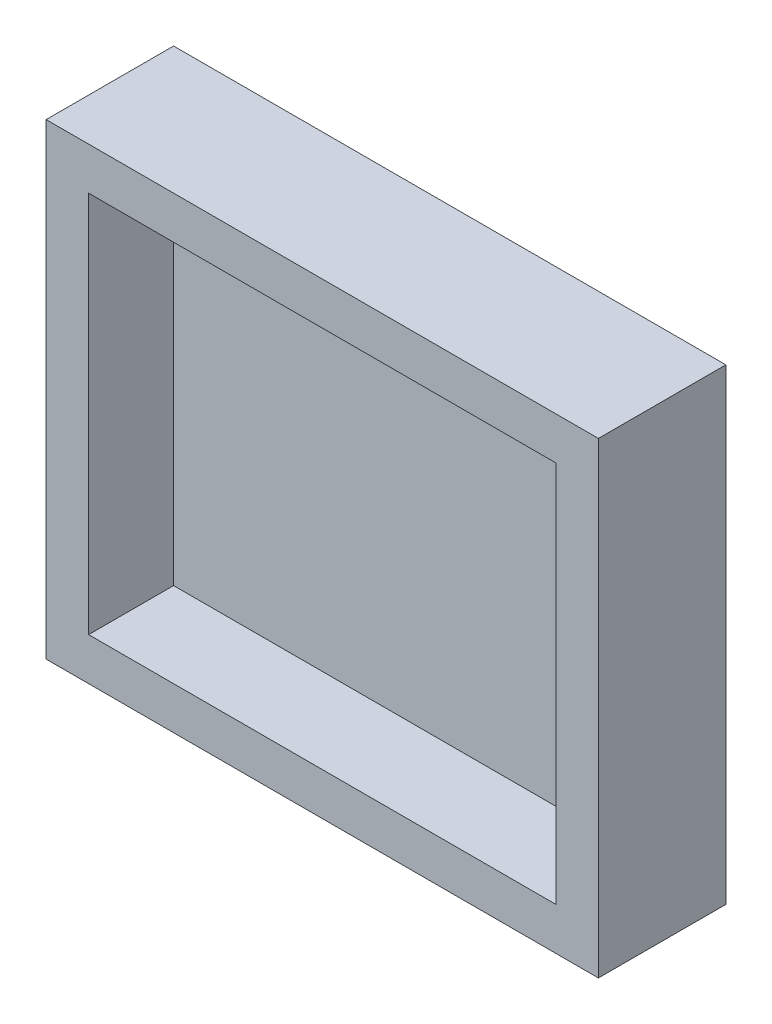
ISO-10303-21;
HEADER;
FILE_DESCRIPTION(('STEP AP214'),'2;1');
FILE_NAME('part.step','',(''),(''),'','','');
FILE_SCHEMA(('AUTOMOTIVE_DESIGN { 1 0 10303 214 1 1 1 1 }'));
ENDSEC;
DATA;
#1=APPLICATION_CONTEXT('core data for automotive mechanical design processes');
#2=APPLICATION_PROTOCOL_DEFINITION('international standard','automotive_design',2000,#1);
#3=PRODUCT_CONTEXT('',#1,'mechanical');
#4=PRODUCT('Part','Part','',(#3));
#5=PRODUCT_RELATED_PRODUCT_CATEGORY('part','',(#4));
#6=PRODUCT_DEFINITION_FORMATION('','',#4);
#7=PRODUCT_DEFINITION_CONTEXT('part definition',#1,'design');
#8=PRODUCT_DEFINITION('design','',#6,#7);
#9=PRODUCT_DEFINITION_SHAPE('','',#8);
#10=(LENGTH_UNIT() NAMED_UNIT(*) SI_UNIT(.MILLI.,.METRE.));
#11=(NAMED_UNIT(*) PLANE_ANGLE_UNIT() SI_UNIT($,.RADIAN.));
#12=(NAMED_UNIT(*) SI_UNIT($,.STERADIAN.) SOLID_ANGLE_UNIT());
#13=UNCERTAINTY_MEASURE_WITH_UNIT(LENGTH_MEASURE(1.E-05),#10,'distance_accuracy_value','');
#14=(GEOMETRIC_REPRESENTATION_CONTEXT(3) GLOBAL_UNCERTAINTY_ASSIGNED_CONTEXT((#13)) GLOBAL_UNIT_ASSIGNED_CONTEXT((#10,
#11,#12)) REPRESENTATION_CONTEXT('',''));
#15=CARTESIAN_POINT('',(0.,0.,0.));
#16=DIRECTION('',(0.,0.,1.));
#17=DIRECTION('',(1.,0.,0.));
#18=AXIS2_PLACEMENT_3D('',#15,#16,#17);
#19=CARTESIAN_POINT('',(-32.5,-27.5,15.));
#20=DIRECTION('',(0.,1.,0.));
#21=DIRECTION('',(0.,0.,1.));
#22=AXIS2_PLACEMENT_3D('',#19,#20,#21);
#23=PLANE('',#22);
#24=DIRECTION('',(1.,0.,0.));
#25=VECTOR('',#24,1.);
#26=CARTESIAN_POINT('',(-32.5,-27.5,0.));
#27=LINE('',#26,#25);
#28=CARTESIAN_POINT('',(-32.5,-27.5,0.));
#29=VERTEX_POINT('',#28);
#30=CARTESIAN_POINT('',(32.5,-27.5,0.));
#31=VERTEX_POINT('',#30);
#32=EDGE_CURVE('E140',#29,#31,#27,.T.);
#33=ORIENTED_EDGE('',*,*,#32,.T.);
#34=DIRECTION('',(0.,0.,-1.));
#35=VECTOR('',#34,1.);
#36=CARTESIAN_POINT('',(32.5,-27.5,15.));
#37=LINE('',#36,#35);
#38=CARTESIAN_POINT('',(32.5,-27.5,15.));
#39=VERTEX_POINT('',#38);
#40=EDGE_CURVE('E11',#39,#31,#37,.T.);
#41=ORIENTED_EDGE('',*,*,#40,.F.);
#42=DIRECTION('',(1.,0.,0.));
#43=VECTOR('',#42,1.);
#44=CARTESIAN_POINT('',(-32.5,-27.5,15.));
#45=LINE('',#44,#43);
#46=CARTESIAN_POINT('',(-32.5,-27.5,15.));
#47=VERTEX_POINT('',#46);
#48=EDGE_CURVE('E144',#47,#39,#45,.T.);
#49=ORIENTED_EDGE('',*,*,#48,.F.);
#50=DIRECTION('',(0.,0.,-1.));
#51=VECTOR('',#50,1.);
#52=CARTESIAN_POINT('',(-32.5,-27.5,15.));
#53=LINE('',#52,#51);
#54=EDGE_CURVE('E56',#47,#29,#53,.T.);
#55=ORIENTED_EDGE('',*,*,#54,.T.);
#56=EDGE_LOOP('',(#33,#41,#49,#55));
#57=FACE_BOUND('',#56,.T.);
#58=ADVANCED_FACE('F33',(#57),#23,.F.);
#59=CARTESIAN_POINT('',(32.5,-27.5,15.));
#60=DIRECTION('',(-1.,0.,0.));
#61=DIRECTION('',(0.,0.,1.));
#62=AXIS2_PLACEMENT_3D('',#59,#60,#61);
#63=PLANE('',#62);
#64=DIRECTION('',(0.,1.,0.));
#65=VECTOR('',#64,1.);
#66=CARTESIAN_POINT('',(32.5,-27.5,0.));
#67=LINE('',#66,#65);
#68=CARTESIAN_POINT('',(32.5,27.5,0.));
#69=VERTEX_POINT('',#68);
#70=EDGE_CURVE('E154',#31,#69,#67,.T.);
#71=ORIENTED_EDGE('',*,*,#70,.T.);
#72=DIRECTION('',(0.,0.,-1.));
#73=VECTOR('',#72,1.);
#74=CARTESIAN_POINT('',(32.5,27.5,15.));
#75=LINE('',#74,#73);
#76=CARTESIAN_POINT('',(32.5,27.5,15.));
#77=VERTEX_POINT('',#76);
#78=EDGE_CURVE('E40',#77,#69,#75,.T.);
#79=ORIENTED_EDGE('',*,*,#78,.F.);
#80=DIRECTION('',(0.,1.,0.));
#81=VECTOR('',#80,1.);
#82=CARTESIAN_POINT('',(32.5,-27.5,15.));
#83=LINE('',#82,#81);
#84=EDGE_CURVE('E82',#39,#77,#83,.T.);
#85=ORIENTED_EDGE('',*,*,#84,.F.);
#86=ORIENTED_EDGE('',*,*,#40,.T.);
#87=EDGE_LOOP('',(#71,#79,#85,#86));
#88=FACE_BOUND('',#87,.T.);
#89=ADVANCED_FACE('F168',(#88),#63,.F.);
#90=CARTESIAN_POINT('',(-32.5,27.5,15.));
#91=DIRECTION('',(0.,1.,0.));
#92=DIRECTION('',(0.,0.,1.));
#93=AXIS2_PLACEMENT_3D('',#90,#91,#92);
#94=PLANE('',#93);
#95=DIRECTION('',(1.,0.,0.));
#96=VECTOR('',#95,1.);
#97=CARTESIAN_POINT('',(-32.5,27.5,0.));
#98=LINE('',#97,#96);
#99=CARTESIAN_POINT('',(-32.5,27.5,0.));
#100=VERTEX_POINT('',#99);
#101=EDGE_CURVE('E157',#100,#69,#98,.T.);
#102=ORIENTED_EDGE('',*,*,#101,.F.);
#103=DIRECTION('',(0.,0.,-1.));
#104=VECTOR('',#103,1.);
#105=CARTESIAN_POINT('',(-32.5,27.5,15.));
#106=LINE('',#105,#104);
#107=CARTESIAN_POINT('',(-32.5,27.5,15.));
#108=VERTEX_POINT('',#107);
#109=EDGE_CURVE('E163',#108,#100,#106,.T.);
#110=ORIENTED_EDGE('',*,*,#109,.F.);
#111=DIRECTION('',(1.,0.,0.));
#112=VECTOR('',#111,1.);
#113=CARTESIAN_POINT('',(-32.5,27.5,15.));
#114=LINE('',#113,#112);
#115=EDGE_CURVE('E148',#108,#77,#114,.T.);
#116=ORIENTED_EDGE('',*,*,#115,.T.);
#117=ORIENTED_EDGE('',*,*,#78,.T.);
#118=EDGE_LOOP('',(#102,#110,#116,#117));
#119=FACE_BOUND('',#118,.T.);
#120=ADVANCED_FACE('F166',(#119),#94,.T.);
#121=CARTESIAN_POINT('',(-32.5,-27.5,15.));
#122=DIRECTION('',(-1.,0.,0.));
#123=DIRECTION('',(0.,0.,1.));
#124=AXIS2_PLACEMENT_3D('',#121,#122,#123);
#125=PLANE('',#124);
#126=DIRECTION('',(0.,1.,0.));
#127=VECTOR('',#126,1.);
#128=CARTESIAN_POINT('',(-32.5,-27.5,0.));
#129=LINE('',#128,#127);
#130=EDGE_CURVE('E146',#29,#100,#129,.T.);
#131=ORIENTED_EDGE('',*,*,#130,.F.);
#132=ORIENTED_EDGE('',*,*,#54,.F.);
#133=DIRECTION('',(0.,1.,0.));
#134=VECTOR('',#133,1.);
#135=CARTESIAN_POINT('',(-32.5,-27.5,15.));
#136=LINE('',#135,#134);
#137=EDGE_CURVE('E151',#47,#108,#136,.T.);
#138=ORIENTED_EDGE('',*,*,#137,.T.);
#139=ORIENTED_EDGE('',*,*,#109,.T.);
#140=EDGE_LOOP('',(#131,#132,#138,#139));
#141=FACE_BOUND('',#140,.T.);
#142=ADVANCED_FACE('F172',(#141),#125,.T.);
#143=CARTESIAN_POINT('',(0.,0.,15.));
#144=DIRECTION('',(0.,0.,1.));
#145=DIRECTION('',(1.,0.,0.));
#146=AXIS2_PLACEMENT_3D('',#143,#144,#145);
#147=PLANE('',#146);
#148=DIRECTION('',(0.,1.,0.));
#149=VECTOR('',#148,1.);
#150=CARTESIAN_POINT('',(27.5,-22.5,15.));
#151=LINE('',#150,#149);
#152=CARTESIAN_POINT('',(27.5,-22.5,15.));
#153=VERTEX_POINT('',#152);
#154=CARTESIAN_POINT('',(27.5,22.5,15.));
#155=VERTEX_POINT('',#154);
#156=EDGE_CURVE('E47',#153,#155,#151,.T.);
#157=ORIENTED_EDGE('',*,*,#156,.F.);
#158=DIRECTION('',(1.,0.,0.));
#159=VECTOR('',#158,1.);
#160=CARTESIAN_POINT('',(-27.5,-22.5,15.));
#161=LINE('',#160,#159);
#162=CARTESIAN_POINT('',(-27.5,-22.5,15.));
#163=VERTEX_POINT('',#162);
#164=EDGE_CURVE('E125',#163,#153,#161,.T.);
#165=ORIENTED_EDGE('',*,*,#164,.F.);
#166=DIRECTION('',(0.,-1.,0.));
#167=VECTOR('',#166,1.);
#168=CARTESIAN_POINT('',(-27.5,-22.5,15.));
#169=LINE('',#168,#167);
#170=CARTESIAN_POINT('',(-27.5,22.5,15.));
#171=VERTEX_POINT('',#170);
#172=EDGE_CURVE('E128',#171,#163,#169,.T.);
#173=ORIENTED_EDGE('',*,*,#172,.F.);
#174=DIRECTION('',(-1.,0.,0.));
#175=VECTOR('',#174,1.);
#176=CARTESIAN_POINT('',(-27.5,22.5,15.));
#177=LINE('',#176,#175);
#178=EDGE_CURVE('E134',#155,#171,#177,.T.);
#179=ORIENTED_EDGE('',*,*,#178,.F.);
#180=EDGE_LOOP('',(#157,#165,#173,#179));
#181=FACE_BOUND('',#180,.T.);
#182=ORIENTED_EDGE('',*,*,#48,.T.);
#183=ORIENTED_EDGE('',*,*,#84,.T.);
#184=ORIENTED_EDGE('',*,*,#115,.F.);
#185=ORIENTED_EDGE('',*,*,#137,.F.);
#186=EDGE_LOOP('',(#182,#183,#184,#185));
#187=FACE_BOUND('',#186,.T.);
#188=ADVANCED_FACE('F175',(#181,#187),#147,.T.);
#189=CARTESIAN_POINT('',(0.,0.,0.));
#190=DIRECTION('',(0.,0.,1.));
#191=DIRECTION('',(1.,0.,0.));
#192=AXIS2_PLACEMENT_3D('',#189,#190,#191);
#193=PLANE('',#192);
#194=ORIENTED_EDGE('',*,*,#32,.F.);
#195=ORIENTED_EDGE('',*,*,#130,.T.);
#196=ORIENTED_EDGE('',*,*,#101,.T.);
#197=ORIENTED_EDGE('',*,*,#70,.F.);
#198=EDGE_LOOP('',(#194,#195,#196,#197));
#199=FACE_BOUND('',#198,.T.);
#200=ADVANCED_FACE('F171',(#199),#193,.F.);
#201=CARTESIAN_POINT('',(27.5,-22.5,5.));
#202=DIRECTION('',(1.,0.,0.));
#203=DIRECTION('',(0.,0.,-1.));
#204=AXIS2_PLACEMENT_3D('',#201,#202,#203);
#205=PLANE('',#204);
#206=ORIENTED_EDGE('',*,*,#156,.T.);
#207=DIRECTION('',(0.,0.,1.));
#208=VECTOR('',#207,1.);
#209=CARTESIAN_POINT('',(27.5,22.5,5.));
#210=LINE('',#209,#208);
#211=CARTESIAN_POINT('',(27.5,22.5,5.));
#212=VERTEX_POINT('',#211);
#213=EDGE_CURVE('E103',#212,#155,#210,.T.);
#214=ORIENTED_EDGE('',*,*,#213,.F.);
#215=DIRECTION('',(0.,1.,0.));
#216=VECTOR('',#215,1.);
#217=CARTESIAN_POINT('',(27.5,-22.5,5.));
#218=LINE('',#217,#216);
#219=CARTESIAN_POINT('',(27.5,-22.5,5.));
#220=VERTEX_POINT('',#219);
#221=EDGE_CURVE('E107',#220,#212,#218,.T.);
#222=ORIENTED_EDGE('',*,*,#221,.F.);
#223=DIRECTION('',(0.,0.,1.));
#224=VECTOR('',#223,1.);
#225=CARTESIAN_POINT('',(27.5,-22.5,5.));
#226=LINE('',#225,#224);
#227=EDGE_CURVE('E138',#220,#153,#226,.T.);
#228=ORIENTED_EDGE('',*,*,#227,.T.);
#229=EDGE_LOOP('',(#206,#214,#222,#228));
#230=FACE_BOUND('',#229,.T.);
#231=ADVANCED_FACE('F105',(#230),#205,.F.);
#232=CARTESIAN_POINT('',(-27.5,-22.5,5.));
#233=DIRECTION('',(0.,-1.,0.));
#234=DIRECTION('',(0.,0.,-1.));
#235=AXIS2_PLACEMENT_3D('',#232,#233,#234);
#236=PLANE('',#235);
#237=ORIENTED_EDGE('',*,*,#164,.T.);
#238=ORIENTED_EDGE('',*,*,#227,.F.);
#239=DIRECTION('',(1.,0.,0.));
#240=VECTOR('',#239,1.);
#241=CARTESIAN_POINT('',(-27.5,-22.5,5.));
#242=LINE('',#241,#240);
#243=CARTESIAN_POINT('',(-27.5,-22.5,5.));
#244=VERTEX_POINT('',#243);
#245=EDGE_CURVE('E113',#244,#220,#242,.T.);
#246=ORIENTED_EDGE('',*,*,#245,.F.);
#247=DIRECTION('',(0.,0.,1.));
#248=VECTOR('',#247,1.);
#249=CARTESIAN_POINT('',(-27.5,-22.5,5.));
#250=LINE('',#249,#248);
#251=EDGE_CURVE('E141',#244,#163,#250,.T.);
#252=ORIENTED_EDGE('',*,*,#251,.T.);
#253=EDGE_LOOP('',(#237,#238,#246,#252));
#254=FACE_BOUND('',#253,.T.);
#255=ADVANCED_FACE('F194',(#254),#236,.F.);
#256=CARTESIAN_POINT('',(-27.5,-22.5,5.));
#257=DIRECTION('',(-1.,0.,0.));
#258=DIRECTION('',(0.,0.,1.));
#259=AXIS2_PLACEMENT_3D('',#256,#257,#258);
#260=PLANE('',#259);
#261=ORIENTED_EDGE('',*,*,#172,.T.);
#262=ORIENTED_EDGE('',*,*,#251,.F.);
#263=DIRECTION('',(0.,-1.,0.));
#264=VECTOR('',#263,1.);
#265=CARTESIAN_POINT('',(-27.5,-22.5,5.));
#266=LINE('',#265,#264);
#267=CARTESIAN_POINT('',(-27.5,22.5,5.));
#268=VERTEX_POINT('',#267);
#269=EDGE_CURVE('E121',#268,#244,#266,.T.);
#270=ORIENTED_EDGE('',*,*,#269,.F.);
#271=DIRECTION('',(0.,0.,1.));
#272=VECTOR('',#271,1.);
#273=CARTESIAN_POINT('',(-27.5,22.5,5.));
#274=LINE('',#273,#272);
#275=EDGE_CURVE('E112',#268,#171,#274,.T.);
#276=ORIENTED_EDGE('',*,*,#275,.T.);
#277=EDGE_LOOP('',(#261,#262,#270,#276));
#278=FACE_BOUND('',#277,.T.);
#279=ADVANCED_FACE('F197',(#278),#260,.F.);
#280=CARTESIAN_POINT('',(-27.5,22.5,5.));
#281=DIRECTION('',(0.,1.,0.));
#282=DIRECTION('',(0.,0.,1.));
#283=AXIS2_PLACEMENT_3D('',#280,#281,#282);
#284=PLANE('',#283);
#285=ORIENTED_EDGE('',*,*,#178,.T.);
#286=ORIENTED_EDGE('',*,*,#275,.F.);
#287=DIRECTION('',(-1.,0.,0.));
#288=VECTOR('',#287,1.);
#289=CARTESIAN_POINT('',(-27.5,22.5,5.));
#290=LINE('',#289,#288);
#291=EDGE_CURVE('E116',#212,#268,#290,.T.);
#292=ORIENTED_EDGE('',*,*,#291,.F.);
#293=ORIENTED_EDGE('',*,*,#213,.T.);
#294=EDGE_LOOP('',(#285,#286,#292,#293));
#295=FACE_BOUND('',#294,.T.);
#296=ADVANCED_FACE('F117',(#295),#284,.F.);
#297=CARTESIAN_POINT('',(0.,0.,5.));
#298=DIRECTION('',(0.,0.,-1.));
#299=DIRECTION('',(-1.,0.,0.));
#300=AXIS2_PLACEMENT_3D('',#297,#298,#299);
#301=PLANE('',#300);
#302=ORIENTED_EDGE('',*,*,#221,.T.);
#303=ORIENTED_EDGE('',*,*,#291,.T.);
#304=ORIENTED_EDGE('',*,*,#269,.T.);
#305=ORIENTED_EDGE('',*,*,#245,.T.);
#306=EDGE_LOOP('',(#302,#303,#304,#305));
#307=FACE_BOUND('',#306,.T.);
#308=ADVANCED_FACE('F123',(#307),#301,.F.);
#309=CLOSED_SHELL('',(#58,#89,#120,#142,#188,#200,#231,#255,#279,#296,#308));
#310=MANIFOLD_SOLID_BREP('B2',#309);
#311=ADVANCED_BREP_SHAPE_REPRESENTATION('',(#18,#310),#14);
#312=SHAPE_DEFINITION_REPRESENTATION(#9,#311);
ENDSEC;
END-ISO-10303-21;
